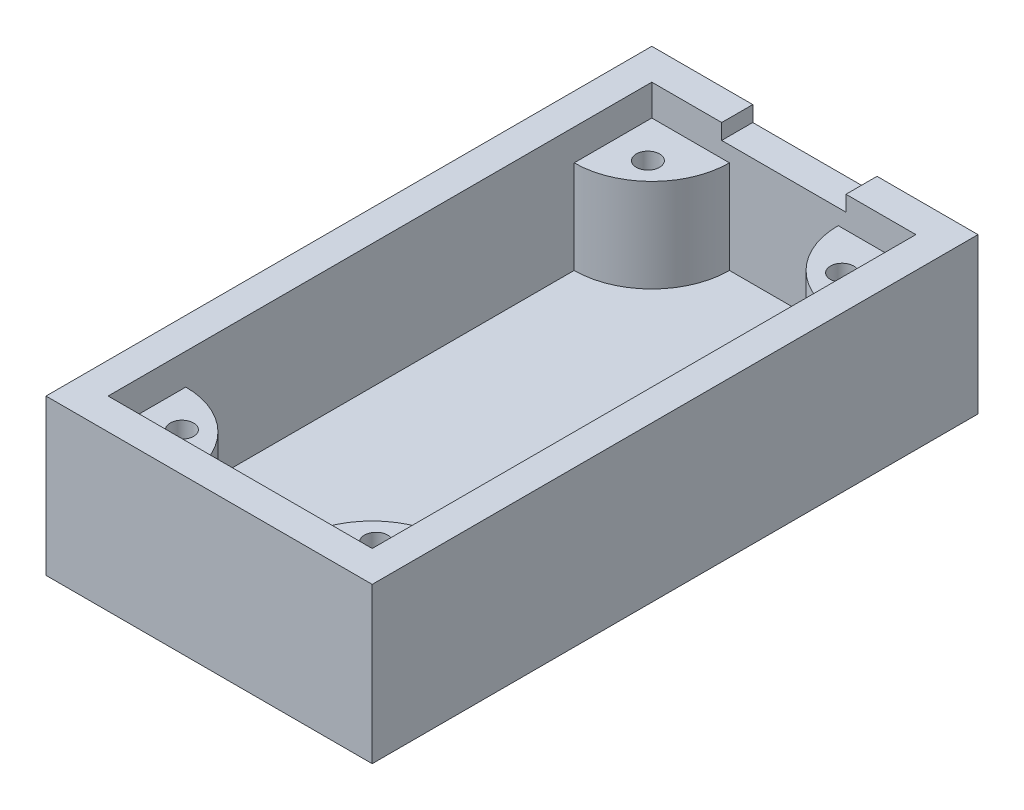
ISO-10303-21;
HEADER;
FILE_DESCRIPTION(('STEP AP214'),'2;1');
FILE_NAME('part.step','',(''),(''),'','','');
FILE_SCHEMA(('AUTOMOTIVE_DESIGN { 1 0 10303 214 1 1 1 1 }'));
ENDSEC;
DATA;
#1=APPLICATION_CONTEXT('core data for automotive mechanical design processes');
#2=APPLICATION_PROTOCOL_DEFINITION('international standard','automotive_design',2000,#1);
#3=PRODUCT_CONTEXT('',#1,'mechanical');
#4=PRODUCT('Part','Part','',(#3));
#5=PRODUCT_RELATED_PRODUCT_CATEGORY('part','',(#4));
#6=PRODUCT_DEFINITION_FORMATION('','',#4);
#7=PRODUCT_DEFINITION_CONTEXT('part definition',#1,'design');
#8=PRODUCT_DEFINITION('design','',#6,#7);
#9=PRODUCT_DEFINITION_SHAPE('','',#8);
#10=(LENGTH_UNIT() NAMED_UNIT(*) SI_UNIT(.MILLI.,.METRE.));
#11=(NAMED_UNIT(*) PLANE_ANGLE_UNIT() SI_UNIT($,.RADIAN.));
#12=(NAMED_UNIT(*) SI_UNIT($,.STERADIAN.) SOLID_ANGLE_UNIT());
#13=UNCERTAINTY_MEASURE_WITH_UNIT(LENGTH_MEASURE(1.E-05),#10,'distance_accuracy_value','');
#14=(GEOMETRIC_REPRESENTATION_CONTEXT(3) GLOBAL_UNCERTAINTY_ASSIGNED_CONTEXT((#13)) GLOBAL_UNIT_ASSIGNED_CONTEXT((#10,
#11,#12)) REPRESENTATION_CONTEXT('',''));
#15=CARTESIAN_POINT('',(0.,0.,0.));
#16=DIRECTION('',(0.,0.,1.));
#17=DIRECTION('',(1.,0.,0.));
#18=AXIS2_PLACEMENT_3D('',#15,#16,#17);
#19=CARTESIAN_POINT('',(0.,8.,-35.));
#20=DIRECTION('',(0.,0.,1.));
#21=DIRECTION('',(1.,0.,0.));
#22=AXIS2_PLACEMENT_3D('',#19,#20,#21);
#23=PLANE('',#22);
#24=DIRECTION('',(0.,-1.,0.));
#25=VECTOR('',#24,1.);
#26=CARTESIAN_POINT('',(12.5,8.,-35.));
#27=LINE('',#26,#25);
#28=CARTESIAN_POINT('',(12.5,8.,-35.));
#29=VERTEX_POINT('',#28);
#30=CARTESIAN_POINT('',(12.5,7.,-35.));
#31=VERTEX_POINT('',#30);
#32=EDGE_CURVE('E201',#29,#31,#27,.T.);
#33=ORIENTED_EDGE('',*,*,#32,.T.);
#34=DIRECTION('',(-1.,0.,0.));
#35=VECTOR('',#34,1.);
#36=CARTESIAN_POINT('',(12.5,7.,-35.));
#37=LINE('',#36,#35);
#38=CARTESIAN_POINT('',(4.5,7.,-35.));
#39=VERTEX_POINT('',#38);
#40=EDGE_CURVE('E193',#31,#39,#37,.T.);
#41=ORIENTED_EDGE('',*,*,#40,.T.);
#42=DIRECTION('',(0.,1.,0.));
#43=VECTOR('',#42,1.);
#44=CARTESIAN_POINT('',(4.5,8.,-35.));
#45=LINE('',#44,#43);
#46=CARTESIAN_POINT('',(4.5,8.,-35.));
#47=VERTEX_POINT('',#46);
#48=EDGE_CURVE('E179',#39,#47,#45,.T.);
#49=ORIENTED_EDGE('',*,*,#48,.T.);
#50=DIRECTION('',(-1.,0.,0.));
#51=VECTOR('',#50,1.);
#52=CARTESIAN_POINT('',(0.,8.,-35.));
#53=LINE('',#52,#51);
#54=CARTESIAN_POINT('',(0.,8.,-35.));
#55=VERTEX_POINT('',#54);
#56=EDGE_CURVE('E374',#47,#55,#53,.T.);
#57=ORIENTED_EDGE('',*,*,#56,.T.);
#58=DIRECTION('',(0.,-1.,0.));
#59=VECTOR('',#58,1.);
#60=CARTESIAN_POINT('',(0.,8.,-35.));
#61=LINE('',#60,#59);
#62=CARTESIAN_POINT('',(0.,6.,-35.));
#63=VERTEX_POINT('',#62);
#64=EDGE_CURVE('E378',#55,#63,#61,.T.);
#65=ORIENTED_EDGE('',*,*,#64,.T.);
#66=DIRECTION('',(-1.,0.,0.));
#67=VECTOR('',#66,1.);
#68=CARTESIAN_POINT('',(5.,6.,-35.));
#69=LINE('',#68,#67);
#70=CARTESIAN_POINT('',(5.,6.,-35.));
#71=VERTEX_POINT('',#70);
#72=EDGE_CURVE('E64',#71,#63,#69,.T.);
#73=ORIENTED_EDGE('',*,*,#72,.F.);
#74=DIRECTION('',(0.,-1.,0.));
#75=VECTOR('',#74,1.);
#76=CARTESIAN_POINT('',(5.,15.0710678118655,-35.));
#77=LINE('',#76,#75);
#78=CARTESIAN_POINT('',(5.,0.,-35.));
#79=VERTEX_POINT('',#78);
#80=EDGE_CURVE('E244',#71,#79,#77,.T.);
#81=ORIENTED_EDGE('',*,*,#80,.T.);
#82=DIRECTION('',(-1.,0.,0.));
#83=VECTOR('',#82,1.);
#84=CARTESIAN_POINT('',(0.,0.,-35.));
#85=LINE('',#84,#83);
#86=CARTESIAN_POINT('',(12.,0.,-35.));
#87=VERTEX_POINT('',#86);
#88=EDGE_CURVE('E367',#87,#79,#85,.T.);
#89=ORIENTED_EDGE('',*,*,#88,.F.);
#90=DIRECTION('',(0.,-1.,0.));
#91=VECTOR('',#90,1.);
#92=CARTESIAN_POINT('',(12.,15.0710678118655,-35.));
#93=LINE('',#92,#91);
#94=CARTESIAN_POINT('',(12.,6.,-35.));
#95=VERTEX_POINT('',#94);
#96=EDGE_CURVE('E271',#95,#87,#93,.T.);
#97=ORIENTED_EDGE('',*,*,#96,.F.);
#98=DIRECTION('',(-1.,0.,0.));
#99=VECTOR('',#98,1.);
#100=CARTESIAN_POINT('',(17.,6.,-35.));
#101=LINE('',#100,#99);
#102=CARTESIAN_POINT('',(17.,6.,-35.));
#103=VERTEX_POINT('',#102);
#104=EDGE_CURVE('E251',#103,#95,#101,.T.);
#105=ORIENTED_EDGE('',*,*,#104,.F.);
#106=DIRECTION('',(0.,-1.,0.));
#107=VECTOR('',#106,1.);
#108=CARTESIAN_POINT('',(17.,8.,-35.));
#109=LINE('',#108,#107);
#110=CARTESIAN_POINT('',(17.,8.,-35.));
#111=VERTEX_POINT('',#110);
#112=EDGE_CURVE('E391',#111,#103,#109,.T.);
#113=ORIENTED_EDGE('',*,*,#112,.F.);
#114=EDGE_CURVE('E375',#111,#29,#53,.T.);
#115=ORIENTED_EDGE('',*,*,#114,.T.);
#116=EDGE_LOOP('',(#33,#41,#49,#57,#65,#73,#81,#89,#97,#105,#113,#115));
#117=FACE_BOUND('',#116,.T.);
#118=ADVANCED_FACE('F40',(#117),#23,.T.);
#119=CARTESIAN_POINT('',(0.,8.,0.));
#120=DIRECTION('',(1.,0.,0.));
#121=DIRECTION('',(0.,0.,-1.));
#122=AXIS2_PLACEMENT_3D('',#119,#120,#121);
#123=PLANE('',#122);
#124=DIRECTION('',(0.,0.,1.));
#125=VECTOR('',#124,1.);
#126=CARTESIAN_POINT('',(0.,0.,0.));
#127=LINE('',#126,#125);
#128=CARTESIAN_POINT('',(0.,0.,-30.));
#129=VERTEX_POINT('',#128);
#130=CARTESIAN_POINT('',(0.,0.,-5.));
#131=VERTEX_POINT('',#130);
#132=EDGE_CURVE('E362',#129,#131,#127,.T.);
#133=ORIENTED_EDGE('',*,*,#132,.F.);
#134=DIRECTION('',(0.,-1.,0.));
#135=VECTOR('',#134,1.);
#136=CARTESIAN_POINT('',(0.,15.0710678118655,-30.));
#137=LINE('',#136,#135);
#138=CARTESIAN_POINT('',(0.,6.,-30.));
#139=VERTEX_POINT('',#138);
#140=EDGE_CURVE('E240',#139,#129,#137,.T.);
#141=ORIENTED_EDGE('',*,*,#140,.F.);
#142=DIRECTION('',(0.,0.,1.));
#143=VECTOR('',#142,1.);
#144=CARTESIAN_POINT('',(0.,6.,-30.));
#145=LINE('',#144,#143);
#146=EDGE_CURVE('E222',#63,#139,#145,.T.);
#147=ORIENTED_EDGE('',*,*,#146,.F.);
#148=ORIENTED_EDGE('',*,*,#64,.F.);
#149=DIRECTION('',(0.,0.,1.));
#150=VECTOR('',#149,1.);
#151=CARTESIAN_POINT('',(0.,8.,0.));
#152=LINE('',#151,#150);
#153=CARTESIAN_POINT('',(0.,8.,0.));
#154=VERTEX_POINT('',#153);
#155=EDGE_CURVE('E363',#55,#154,#152,.T.);
#156=ORIENTED_EDGE('',*,*,#155,.T.);
#157=DIRECTION('',(0.,-1.,0.));
#158=VECTOR('',#157,1.);
#159=CARTESIAN_POINT('',(0.,8.,0.));
#160=LINE('',#159,#158);
#161=CARTESIAN_POINT('',(0.,6.,0.));
#162=VERTEX_POINT('',#161);
#163=EDGE_CURVE('E399',#154,#162,#160,.T.);
#164=ORIENTED_EDGE('',*,*,#163,.T.);
#165=DIRECTION('',(0.,0.,1.));
#166=VECTOR('',#165,1.);
#167=CARTESIAN_POINT('',(0.,6.,0.));
#168=LINE('',#167,#166);
#169=CARTESIAN_POINT('',(0.,6.,-5.));
#170=VERTEX_POINT('',#169);
#171=EDGE_CURVE('E287',#170,#162,#168,.T.);
#172=ORIENTED_EDGE('',*,*,#171,.F.);
#173=DIRECTION('',(0.,-1.,0.));
#174=VECTOR('',#173,1.);
#175=CARTESIAN_POINT('',(0.,15.0710678118655,-5.));
#176=LINE('',#175,#174);
#177=EDGE_CURVE('E307',#170,#131,#176,.T.);
#178=ORIENTED_EDGE('',*,*,#177,.T.);
#179=EDGE_LOOP('',(#133,#141,#147,#148,#156,#164,#172,#178));
#180=FACE_BOUND('',#179,.T.);
#181=ADVANCED_FACE('F455',(#180),#123,.T.);
#182=CARTESIAN_POINT('',(17.,8.,0.));
#183=DIRECTION('',(-1.,0.,0.));
#184=DIRECTION('',(0.,0.,1.));
#185=AXIS2_PLACEMENT_3D('',#182,#183,#184);
#186=PLANE('',#185);
#187=DIRECTION('',(0.,0.,-1.));
#188=VECTOR('',#187,1.);
#189=CARTESIAN_POINT('',(17.,6.,-30.));
#190=LINE('',#189,#188);
#191=CARTESIAN_POINT('',(17.,6.,-30.));
#192=VERTEX_POINT('',#191);
#193=EDGE_CURVE('E255',#192,#103,#190,.T.);
#194=ORIENTED_EDGE('',*,*,#193,.F.);
#195=DIRECTION('',(0.,-1.,0.));
#196=VECTOR('',#195,1.);
#197=CARTESIAN_POINT('',(17.,15.0710678118655,-30.));
#198=LINE('',#197,#196);
#199=CARTESIAN_POINT('',(17.,0.,-30.));
#200=VERTEX_POINT('',#199);
#201=EDGE_CURVE('E275',#192,#200,#198,.T.);
#202=ORIENTED_EDGE('',*,*,#201,.T.);
#203=DIRECTION('',(0.,0.,-1.));
#204=VECTOR('',#203,1.);
#205=CARTESIAN_POINT('',(17.,0.,0.));
#206=LINE('',#205,#204);
#207=CARTESIAN_POINT('',(17.,0.,-5.));
#208=VERTEX_POINT('',#207);
#209=EDGE_CURVE('E384',#208,#200,#206,.T.);
#210=ORIENTED_EDGE('',*,*,#209,.F.);
#211=DIRECTION('',(0.,-1.,0.));
#212=VECTOR('',#211,1.);
#213=CARTESIAN_POINT('',(17.,15.0710678118655,-5.));
#214=LINE('',#213,#212);
#215=CARTESIAN_POINT('',(17.,6.,-5.));
#216=VERTEX_POINT('',#215);
#217=EDGE_CURVE('E339',#216,#208,#214,.T.);
#218=ORIENTED_EDGE('',*,*,#217,.F.);
#219=DIRECTION('',(0.,0.,-1.));
#220=VECTOR('',#219,1.);
#221=CARTESIAN_POINT('',(17.,6.,0.));
#222=LINE('',#221,#220);
#223=CARTESIAN_POINT('',(17.,6.,0.));
#224=VERTEX_POINT('',#223);
#225=EDGE_CURVE('E323',#224,#216,#222,.T.);
#226=ORIENTED_EDGE('',*,*,#225,.F.);
#227=DIRECTION('',(0.,-1.,0.));
#228=VECTOR('',#227,1.);
#229=CARTESIAN_POINT('',(17.,8.,0.));
#230=LINE('',#229,#228);
#231=CARTESIAN_POINT('',(17.,8.,0.));
#232=VERTEX_POINT('',#231);
#233=EDGE_CURVE('E395',#232,#224,#230,.T.);
#234=ORIENTED_EDGE('',*,*,#233,.F.);
#235=DIRECTION('',(0.,0.,-1.));
#236=VECTOR('',#235,1.);
#237=CARTESIAN_POINT('',(17.,8.,0.));
#238=LINE('',#237,#236);
#239=EDGE_CURVE('E370',#232,#111,#238,.T.);
#240=ORIENTED_EDGE('',*,*,#239,.T.);
#241=ORIENTED_EDGE('',*,*,#112,.T.);
#242=EDGE_LOOP('',(#194,#202,#210,#218,#226,#234,#240,#241));
#243=FACE_BOUND('',#242,.T.);
#244=ADVANCED_FACE('F464',(#243),#186,.T.);
#245=CARTESIAN_POINT('',(0.,8.,0.));
#246=DIRECTION('',(0.,0.,-1.));
#247=DIRECTION('',(-1.,0.,0.));
#248=AXIS2_PLACEMENT_3D('',#245,#246,#247);
#249=PLANE('',#248);
#250=DIRECTION('',(1.,0.,0.));
#251=VECTOR('',#250,1.);
#252=CARTESIAN_POINT('',(0.,0.,0.));
#253=LINE('',#252,#251);
#254=CARTESIAN_POINT('',(5.,0.,0.));
#255=VERTEX_POINT('',#254);
#256=CARTESIAN_POINT('',(12.,0.,0.));
#257=VERTEX_POINT('',#256);
#258=EDGE_CURVE('E381',#255,#257,#253,.T.);
#259=ORIENTED_EDGE('',*,*,#258,.F.);
#260=DIRECTION('',(0.,-1.,0.));
#261=VECTOR('',#260,1.);
#262=CARTESIAN_POINT('',(5.,15.0710678118655,0.));
#263=LINE('',#262,#261);
#264=CARTESIAN_POINT('',(5.,6.,0.));
#265=VERTEX_POINT('',#264);
#266=EDGE_CURVE('E303',#265,#255,#263,.T.);
#267=ORIENTED_EDGE('',*,*,#266,.F.);
#268=DIRECTION('',(1.,0.,0.));
#269=VECTOR('',#268,1.);
#270=CARTESIAN_POINT('',(5.,6.,0.));
#271=LINE('',#270,#269);
#272=EDGE_CURVE('E283',#162,#265,#271,.T.);
#273=ORIENTED_EDGE('',*,*,#272,.F.);
#274=ORIENTED_EDGE('',*,*,#163,.F.);
#275=DIRECTION('',(1.,0.,0.));
#276=VECTOR('',#275,1.);
#277=CARTESIAN_POINT('',(0.,8.,0.));
#278=LINE('',#277,#276);
#279=EDGE_CURVE('E366',#154,#232,#278,.T.);
#280=ORIENTED_EDGE('',*,*,#279,.T.);
#281=ORIENTED_EDGE('',*,*,#233,.T.);
#282=DIRECTION('',(1.,0.,0.));
#283=VECTOR('',#282,1.);
#284=CARTESIAN_POINT('',(17.,6.,0.));
#285=LINE('',#284,#283);
#286=CARTESIAN_POINT('',(12.,6.,0.));
#287=VERTEX_POINT('',#286);
#288=EDGE_CURVE('E315',#287,#224,#285,.T.);
#289=ORIENTED_EDGE('',*,*,#288,.F.);
#290=DIRECTION('',(0.,-1.,0.));
#291=VECTOR('',#290,1.);
#292=CARTESIAN_POINT('',(12.,15.0710678118655,0.));
#293=LINE('',#292,#291);
#294=EDGE_CURVE('E335',#287,#257,#293,.T.);
#295=ORIENTED_EDGE('',*,*,#294,.T.);
#296=EDGE_LOOP('',(#259,#267,#273,#274,#280,#281,#289,#295));
#297=FACE_BOUND('',#296,.T.);
#298=ADVANCED_FACE('F462',(#297),#249,.T.);
#299=CARTESIAN_POINT('',(0.,8.,0.));
#300=DIRECTION('',(0.,1.,0.));
#301=DIRECTION('',(0.,0.,1.));
#302=AXIS2_PLACEMENT_3D('',#299,#300,#301);
#303=PLANE('',#302);
#304=DIRECTION('',(0.,0.,-1.));
#305=VECTOR('',#304,1.);
#306=CARTESIAN_POINT('',(12.5,8.,2.001));
#307=LINE('',#306,#305);
#308=CARTESIAN_POINT('',(12.5,8.,-37.));
#309=VERTEX_POINT('',#308);
#310=EDGE_CURVE('E189',#29,#309,#307,.T.);
#311=ORIENTED_EDGE('',*,*,#310,.F.);
#312=ORIENTED_EDGE('',*,*,#114,.F.);
#313=ORIENTED_EDGE('',*,*,#239,.F.);
#314=ORIENTED_EDGE('',*,*,#279,.F.);
#315=ORIENTED_EDGE('',*,*,#155,.F.);
#316=ORIENTED_EDGE('',*,*,#56,.F.);
#317=DIRECTION('',(0.,0.,-1.));
#318=VECTOR('',#317,1.);
#319=CARTESIAN_POINT('',(4.5,8.,2.001));
#320=LINE('',#319,#318);
#321=CARTESIAN_POINT('',(4.5,8.,-37.));
#322=VERTEX_POINT('',#321);
#323=EDGE_CURVE('E185',#47,#322,#320,.T.);
#324=ORIENTED_EDGE('',*,*,#323,.T.);
#325=DIRECTION('',(-1.,0.,0.));
#326=VECTOR('',#325,1.);
#327=CARTESIAN_POINT('',(-2.,8.,-37.));
#328=LINE('',#327,#326);
#329=CARTESIAN_POINT('',(-2.,8.,-37.));
#330=VERTEX_POINT('',#329);
#331=EDGE_CURVE('E413',#322,#330,#328,.T.);
#332=ORIENTED_EDGE('',*,*,#331,.T.);
#333=DIRECTION('',(0.,0.,1.));
#334=VECTOR('',#333,1.);
#335=CARTESIAN_POINT('',(-2.,8.,-37.));
#336=LINE('',#335,#334);
#337=CARTESIAN_POINT('',(-2.,8.,2.));
#338=VERTEX_POINT('',#337);
#339=EDGE_CURVE('E403',#330,#338,#336,.T.);
#340=ORIENTED_EDGE('',*,*,#339,.T.);
#341=DIRECTION('',(1.,0.,0.));
#342=VECTOR('',#341,1.);
#343=CARTESIAN_POINT('',(-2.,8.,2.));
#344=LINE('',#343,#342);
#345=CARTESIAN_POINT('',(19.,8.,2.));
#346=VERTEX_POINT('',#345);
#347=EDGE_CURVE('E407',#338,#346,#344,.T.);
#348=ORIENTED_EDGE('',*,*,#347,.T.);
#349=DIRECTION('',(0.,0.,-1.));
#350=VECTOR('',#349,1.);
#351=CARTESIAN_POINT('',(19.,8.,-37.));
#352=LINE('',#351,#350);
#353=CARTESIAN_POINT('',(19.,8.,-37.));
#354=VERTEX_POINT('',#353);
#355=EDGE_CURVE('E410',#346,#354,#352,.T.);
#356=ORIENTED_EDGE('',*,*,#355,.T.);
#357=EDGE_CURVE('E414',#354,#309,#328,.T.);
#358=ORIENTED_EDGE('',*,*,#357,.T.);
#359=EDGE_LOOP('',(#311,#312,#313,#314,#315,#316,#324,#332,#340,#348,#356,#358));
#360=FACE_BOUND('',#359,.T.);
#361=ADVANCED_FACE('F447',(#360),#303,.T.);
#362=CARTESIAN_POINT('',(-2.,8.,-37.));
#363=DIRECTION('',(1.,0.,0.));
#364=DIRECTION('',(0.,0.,-1.));
#365=AXIS2_PLACEMENT_3D('',#362,#363,#364);
#366=PLANE('',#365);
#367=DIRECTION('',(0.,-1.,0.));
#368=VECTOR('',#367,1.);
#369=CARTESIAN_POINT('',(-2.,8.,-37.));
#370=LINE('',#369,#368);
#371=CARTESIAN_POINT('',(-2.,-2.,-37.));
#372=VERTEX_POINT('',#371);
#373=EDGE_CURVE('E418',#330,#372,#370,.T.);
#374=ORIENTED_EDGE('',*,*,#373,.T.);
#375=DIRECTION('',(0.,0.,-1.));
#376=VECTOR('',#375,1.);
#377=CARTESIAN_POINT('',(-2.,-2.,2.));
#378=LINE('',#377,#376);
#379=CARTESIAN_POINT('',(-2.,-2.,2.));
#380=VERTEX_POINT('',#379);
#381=EDGE_CURVE('E350',#380,#372,#378,.T.);
#382=ORIENTED_EDGE('',*,*,#381,.F.);
#383=DIRECTION('',(0.,-1.,0.));
#384=VECTOR('',#383,1.);
#385=CARTESIAN_POINT('',(-2.,8.,2.));
#386=LINE('',#385,#384);
#387=EDGE_CURVE('E12',#338,#380,#386,.T.);
#388=ORIENTED_EDGE('',*,*,#387,.F.);
#389=ORIENTED_EDGE('',*,*,#339,.F.);
#390=EDGE_LOOP('',(#374,#382,#388,#389));
#391=FACE_BOUND('',#390,.T.);
#392=ADVANCED_FACE('F42',(#391),#366,.F.);
#393=CARTESIAN_POINT('',(-2.,8.,2.));
#394=DIRECTION('',(0.,0.,-1.));
#395=DIRECTION('',(-1.,0.,0.));
#396=AXIS2_PLACEMENT_3D('',#393,#394,#395);
#397=PLANE('',#396);
#398=ORIENTED_EDGE('',*,*,#387,.T.);
#399=DIRECTION('',(-1.,0.,0.));
#400=VECTOR('',#399,1.);
#401=CARTESIAN_POINT('',(19.,-2.,2.));
#402=LINE('',#401,#400);
#403=CARTESIAN_POINT('',(19.,-2.,2.));
#404=VERTEX_POINT('',#403);
#405=EDGE_CURVE('E343',#404,#380,#402,.T.);
#406=ORIENTED_EDGE('',*,*,#405,.F.);
#407=DIRECTION('',(0.,-1.,0.));
#408=VECTOR('',#407,1.);
#409=CARTESIAN_POINT('',(19.,8.,2.));
#410=LINE('',#409,#408);
#411=EDGE_CURVE('E49',#346,#404,#410,.T.);
#412=ORIENTED_EDGE('',*,*,#411,.F.);
#413=ORIENTED_EDGE('',*,*,#347,.F.);
#414=EDGE_LOOP('',(#398,#406,#412,#413));
#415=FACE_BOUND('',#414,.T.);
#416=ADVANCED_FACE('F435',(#415),#397,.F.);
#417=CARTESIAN_POINT('',(19.,8.,-37.));
#418=DIRECTION('',(-1.,0.,0.));
#419=DIRECTION('',(0.,0.,1.));
#420=AXIS2_PLACEMENT_3D('',#417,#418,#419);
#421=PLANE('',#420);
#422=ORIENTED_EDGE('',*,*,#411,.T.);
#423=DIRECTION('',(0.,0.,1.));
#424=VECTOR('',#423,1.);
#425=CARTESIAN_POINT('',(19.,-2.,-37.));
#426=LINE('',#425,#424);
#427=CARTESIAN_POINT('',(19.,-2.,-37.));
#428=VERTEX_POINT('',#427);
#429=EDGE_CURVE('E358',#428,#404,#426,.T.);
#430=ORIENTED_EDGE('',*,*,#429,.F.);
#431=DIRECTION('',(0.,-1.,0.));
#432=VECTOR('',#431,1.);
#433=CARTESIAN_POINT('',(19.,8.,-37.));
#434=LINE('',#433,#432);
#435=EDGE_CURVE('E421',#354,#428,#434,.T.);
#436=ORIENTED_EDGE('',*,*,#435,.F.);
#437=ORIENTED_EDGE('',*,*,#355,.F.);
#438=EDGE_LOOP('',(#422,#430,#436,#437));
#439=FACE_BOUND('',#438,.T.);
#440=ADVANCED_FACE('F428',(#439),#421,.F.);
#441=CARTESIAN_POINT('',(-2.,8.,-37.));
#442=DIRECTION('',(0.,0.,1.));
#443=DIRECTION('',(1.,0.,0.));
#444=AXIS2_PLACEMENT_3D('',#441,#442,#443);
#445=PLANE('',#444);
#446=DIRECTION('',(-1.,0.,0.));
#447=VECTOR('',#446,1.);
#448=CARTESIAN_POINT('',(12.5,7.,-37.));
#449=LINE('',#448,#447);
#450=CARTESIAN_POINT('',(12.5,7.,-37.));
#451=VERTEX_POINT('',#450);
#452=CARTESIAN_POINT('',(4.5,7.,-37.));
#453=VERTEX_POINT('',#452);
#454=EDGE_CURVE('E195',#451,#453,#449,.T.);
#455=ORIENTED_EDGE('',*,*,#454,.F.);
#456=DIRECTION('',(0.,-1.,0.));
#457=VECTOR('',#456,1.);
#458=CARTESIAN_POINT('',(12.5,8.,-37.));
#459=LINE('',#458,#457);
#460=EDGE_CURVE('E56',#309,#451,#459,.T.);
#461=ORIENTED_EDGE('',*,*,#460,.F.);
#462=ORIENTED_EDGE('',*,*,#357,.F.);
#463=ORIENTED_EDGE('',*,*,#435,.T.);
#464=DIRECTION('',(1.,0.,0.));
#465=VECTOR('',#464,1.);
#466=CARTESIAN_POINT('',(-2.,-2.,-37.));
#467=LINE('',#466,#465);
#468=EDGE_CURVE('E354',#372,#428,#467,.T.);
#469=ORIENTED_EDGE('',*,*,#468,.F.);
#470=ORIENTED_EDGE('',*,*,#373,.F.);
#471=ORIENTED_EDGE('',*,*,#331,.F.);
#472=DIRECTION('',(0.,1.,0.));
#473=VECTOR('',#472,1.);
#474=CARTESIAN_POINT('',(4.5,8.,-37.));
#475=LINE('',#474,#473);
#476=EDGE_CURVE('E207',#453,#322,#475,.T.);
#477=ORIENTED_EDGE('',*,*,#476,.F.);
#478=EDGE_LOOP('',(#455,#461,#462,#463,#469,#470,#471,#477));
#479=FACE_BOUND('',#478,.T.);
#480=ADVANCED_FACE('F442',(#479),#445,.F.);
#481=CARTESIAN_POINT('',(0.,0.,0.));
#482=DIRECTION('',(0.,-1.,0.));
#483=DIRECTION('',(0.,0.,-1.));
#484=AXIS2_PLACEMENT_3D('',#481,#482,#483);
#485=PLANE('',#484);
#486=CARTESIAN_POINT('',(0.,0.,-35.));
#487=DIRECTION('',(0.,1.,0.));
#488=DIRECTION('',(0.,0.,1.));
#489=AXIS2_PLACEMENT_3D('',#486,#487,#488);
#490=CIRCLE('',#489,5.);
#491=EDGE_CURVE('E236',#129,#79,#490,.T.);
#492=ORIENTED_EDGE('',*,*,#491,.F.);
#493=ORIENTED_EDGE('',*,*,#132,.T.);
#494=CARTESIAN_POINT('',(0.,0.,0.));
#495=DIRECTION('',(0.,1.,0.));
#496=DIRECTION('',(0.,0.,1.));
#497=AXIS2_PLACEMENT_3D('',#494,#495,#496);
#498=CIRCLE('',#497,5.);
#499=EDGE_CURVE('E299',#255,#131,#498,.T.);
#500=ORIENTED_EDGE('',*,*,#499,.F.);
#501=ORIENTED_EDGE('',*,*,#258,.T.);
#502=CARTESIAN_POINT('',(17.,0.,0.));
#503=DIRECTION('',(0.,1.,0.));
#504=DIRECTION('',(0.,0.,1.));
#505=AXIS2_PLACEMENT_3D('',#502,#503,#504);
#506=CIRCLE('',#505,5.);
#507=EDGE_CURVE('E331',#208,#257,#506,.T.);
#508=ORIENTED_EDGE('',*,*,#507,.F.);
#509=ORIENTED_EDGE('',*,*,#209,.T.);
#510=CARTESIAN_POINT('',(17.,0.,-35.));
#511=DIRECTION('',(0.,1.,0.));
#512=DIRECTION('',(0.,0.,1.));
#513=AXIS2_PLACEMENT_3D('',#510,#511,#512);
#514=CIRCLE('',#513,5.);
#515=EDGE_CURVE('E267',#87,#200,#514,.T.);
#516=ORIENTED_EDGE('',*,*,#515,.F.);
#517=ORIENTED_EDGE('',*,*,#88,.T.);
#518=EDGE_LOOP('',(#492,#493,#500,#501,#508,#509,#516,#517));
#519=FACE_BOUND('',#518,.T.);
#520=ADVANCED_FACE('F473',(#519),#485,.F.);
#521=CARTESIAN_POINT('',(0.,-2.,0.));
#522=DIRECTION('',(0.,-1.,0.));
#523=DIRECTION('',(0.,0.,-1.));
#524=AXIS2_PLACEMENT_3D('',#521,#522,#523);
#525=PLANE('',#524);
#526=ORIENTED_EDGE('',*,*,#405,.T.);
#527=ORIENTED_EDGE('',*,*,#381,.T.);
#528=ORIENTED_EDGE('',*,*,#468,.T.);
#529=ORIENTED_EDGE('',*,*,#429,.T.);
#530=EDGE_LOOP('',(#526,#527,#528,#529));
#531=FACE_BOUND('',#530,.T.);
#532=ADVANCED_FACE('F433',(#531),#525,.T.);
#533=CARTESIAN_POINT('',(17.,15.0710678118655,0.));
#534=DIRECTION('',(0.,-1.,0.));
#535=DIRECTION('',(0.,0.,-1.));
#536=AXIS2_PLACEMENT_3D('',#533,#534,#535);
#537=CYLINDRICAL_SURFACE('',#536,5.);
#538=CARTESIAN_POINT('',(17.,6.,0.));
#539=DIRECTION('',(0.,1.,0.));
#540=DIRECTION('',(0.,0.,1.));
#541=AXIS2_PLACEMENT_3D('',#538,#539,#540);
#542=CIRCLE('',#541,5.);
#543=EDGE_CURVE('E319',#216,#287,#542,.T.);
#544=ORIENTED_EDGE('',*,*,#543,.F.);
#545=ORIENTED_EDGE('',*,*,#217,.T.);
#546=ORIENTED_EDGE('',*,*,#507,.T.);
#547=ORIENTED_EDGE('',*,*,#294,.F.);
#548=EDGE_LOOP('',(#544,#545,#546,#547));
#549=FACE_BOUND('',#548,.T.);
#550=ADVANCED_FACE('F471',(#549),#537,.T.);
#551=CARTESIAN_POINT('',(14.75,15.0710678118655,-2.5));
#552=DIRECTION('',(0.,-1.,0.));
#553=DIRECTION('',(0.,0.,-1.));
#554=AXIS2_PLACEMENT_3D('',#551,#552,#553);
#555=CYLINDRICAL_SURFACE('',#554,0.75);
#556=CARTESIAN_POINT('',(14.75,0.,-2.5));
#557=DIRECTION('',(0.,1.,0.));
#558=DIRECTION('',(0.,0.,1.));
#559=AXIS2_PLACEMENT_3D('',#556,#557,#558);
#560=CIRCLE('',#559,0.75);
#561=CARTESIAN_POINT('',(14.75,0.,-1.75));
#562=VERTEX_POINT('',#561);
#563=EDGE_CURVE('E327',#562,#562,#560,.T.);
#564=ORIENTED_EDGE('',*,*,#563,.F.);
#565=EDGE_LOOP('',(#564));
#566=FACE_BOUND('',#565,.T.);
#567=CARTESIAN_POINT('',(14.75,6.,-2.5));
#568=DIRECTION('',(0.,1.,0.));
#569=DIRECTION('',(0.,0.,1.));
#570=AXIS2_PLACEMENT_3D('',#567,#568,#569);
#571=CIRCLE('',#570,0.75);
#572=CARTESIAN_POINT('',(14.75,6.,-1.75));
#573=VERTEX_POINT('',#572);
#574=EDGE_CURVE('E311',#573,#573,#571,.T.);
#575=ORIENTED_EDGE('',*,*,#574,.T.);
#576=EDGE_LOOP('',(#575));
#577=FACE_BOUND('',#576,.T.);
#578=ADVANCED_FACE('F565',(#566,#577),#555,.F.);
#579=CARTESIAN_POINT('',(0.,6.,0.));
#580=DIRECTION('',(0.,1.,0.));
#581=DIRECTION('',(0.,0.,1.));
#582=AXIS2_PLACEMENT_3D('',#579,#580,#581);
#583=PLANE('',#582);
#584=ORIENTED_EDGE('',*,*,#574,.F.);
#585=EDGE_LOOP('',(#584));
#586=FACE_BOUND('',#585,.T.);
#587=ORIENTED_EDGE('',*,*,#288,.T.);
#588=ORIENTED_EDGE('',*,*,#225,.T.);
#589=ORIENTED_EDGE('',*,*,#543,.T.);
#590=EDGE_LOOP('',(#587,#588,#589));
#591=FACE_BOUND('',#590,.T.);
#592=ADVANCED_FACE('F468',(#586,#591),#583,.T.);
#593=ORIENTED_EDGE('',*,*,#563,.T.);
#594=EDGE_LOOP('',(#593));
#595=FACE_BOUND('',#594,.T.);
#596=ADVANCED_FACE('F499',(#595),#485,.F.);
#597=CARTESIAN_POINT('',(0.,15.0710678118655,0.));
#598=DIRECTION('',(0.,-1.,0.));
#599=DIRECTION('',(0.,0.,-1.));
#600=AXIS2_PLACEMENT_3D('',#597,#598,#599);
#601=CYLINDRICAL_SURFACE('',#600,5.);
#602=CARTESIAN_POINT('',(0.,6.,0.));
#603=DIRECTION('',(0.,1.,0.));
#604=DIRECTION('',(0.,0.,1.));
#605=AXIS2_PLACEMENT_3D('',#602,#603,#604);
#606=CIRCLE('',#605,5.);
#607=EDGE_CURVE('E291',#265,#170,#606,.T.);
#608=ORIENTED_EDGE('',*,*,#607,.F.);
#609=ORIENTED_EDGE('',*,*,#266,.T.);
#610=ORIENTED_EDGE('',*,*,#499,.T.);
#611=ORIENTED_EDGE('',*,*,#177,.F.);
#612=EDGE_LOOP('',(#608,#609,#610,#611));
#613=FACE_BOUND('',#612,.T.);
#614=ADVANCED_FACE('F485',(#613),#601,.T.);
#615=CARTESIAN_POINT('',(2.25,15.0710678118655,-2.5));
#616=DIRECTION('',(0.,-1.,0.));
#617=DIRECTION('',(0.,0.,-1.));
#618=AXIS2_PLACEMENT_3D('',#615,#616,#617);
#619=CYLINDRICAL_SURFACE('',#618,0.75);
#620=CARTESIAN_POINT('',(2.25,0.,-2.5));
#621=DIRECTION('',(0.,1.,0.));
#622=DIRECTION('',(0.,0.,1.));
#623=AXIS2_PLACEMENT_3D('',#620,#621,#622);
#624=CIRCLE('',#623,0.75);
#625=CARTESIAN_POINT('',(2.25,0.,-1.75));
#626=VERTEX_POINT('',#625);
#627=EDGE_CURVE('E295',#626,#626,#624,.T.);
#628=ORIENTED_EDGE('',*,*,#627,.F.);
#629=EDGE_LOOP('',(#628));
#630=FACE_BOUND('',#629,.T.);
#631=CARTESIAN_POINT('',(2.25,6.,-2.5));
#632=DIRECTION('',(0.,1.,0.));
#633=DIRECTION('',(0.,0.,1.));
#634=AXIS2_PLACEMENT_3D('',#631,#632,#633);
#635=CIRCLE('',#634,0.75);
#636=CARTESIAN_POINT('',(2.25,6.,-1.75));
#637=VERTEX_POINT('',#636);
#638=EDGE_CURVE('E279',#637,#637,#635,.T.);
#639=ORIENTED_EDGE('',*,*,#638,.T.);
#640=EDGE_LOOP('',(#639));
#641=FACE_BOUND('',#640,.T.);
#642=ADVANCED_FACE('F490',(#630,#641),#619,.F.);
#643=CARTESIAN_POINT('',(0.,6.,0.));
#644=DIRECTION('',(0.,1.,0.));
#645=DIRECTION('',(0.,0.,1.));
#646=AXIS2_PLACEMENT_3D('',#643,#644,#645);
#647=PLANE('',#646);
#648=ORIENTED_EDGE('',*,*,#638,.F.);
#649=EDGE_LOOP('',(#648));
#650=FACE_BOUND('',#649,.T.);
#651=ORIENTED_EDGE('',*,*,#272,.T.);
#652=ORIENTED_EDGE('',*,*,#607,.T.);
#653=ORIENTED_EDGE('',*,*,#171,.T.);
#654=EDGE_LOOP('',(#651,#652,#653));
#655=FACE_BOUND('',#654,.T.);
#656=ADVANCED_FACE('F487',(#650,#655),#647,.T.);
#657=ORIENTED_EDGE('',*,*,#627,.T.);
#658=EDGE_LOOP('',(#657));
#659=FACE_BOUND('',#658,.T.);
#660=ADVANCED_FACE('F489',(#659),#485,.F.);
#661=CARTESIAN_POINT('',(17.,15.0710678118655,-35.));
#662=DIRECTION('',(0.,-1.,0.));
#663=DIRECTION('',(0.,0.,-1.));
#664=AXIS2_PLACEMENT_3D('',#661,#662,#663);
#665=CYLINDRICAL_SURFACE('',#664,5.);
#666=CARTESIAN_POINT('',(17.,6.,-35.));
#667=DIRECTION('',(0.,1.,0.));
#668=DIRECTION('',(0.,0.,1.));
#669=AXIS2_PLACEMENT_3D('',#666,#667,#668);
#670=CIRCLE('',#669,5.);
#671=EDGE_CURVE('E259',#95,#192,#670,.T.);
#672=ORIENTED_EDGE('',*,*,#671,.F.);
#673=ORIENTED_EDGE('',*,*,#96,.T.);
#674=ORIENTED_EDGE('',*,*,#515,.T.);
#675=ORIENTED_EDGE('',*,*,#201,.F.);
#676=EDGE_LOOP('',(#672,#673,#674,#675));
#677=FACE_BOUND('',#676,.T.);
#678=ADVANCED_FACE('F477',(#677),#665,.T.);
#679=CARTESIAN_POINT('',(14.75,15.0710678118655,-32.5));
#680=DIRECTION('',(0.,-1.,0.));
#681=DIRECTION('',(0.,0.,-1.));
#682=AXIS2_PLACEMENT_3D('',#679,#680,#681);
#683=CYLINDRICAL_SURFACE('',#682,0.75);
#684=CARTESIAN_POINT('',(14.75,0.,-32.5));
#685=DIRECTION('',(0.,1.,0.));
#686=DIRECTION('',(0.,0.,1.));
#687=AXIS2_PLACEMENT_3D('',#684,#685,#686);
#688=CIRCLE('',#687,0.75);
#689=CARTESIAN_POINT('',(14.75,0.,-31.75));
#690=VERTEX_POINT('',#689);
#691=EDGE_CURVE('E263',#690,#690,#688,.T.);
#692=ORIENTED_EDGE('',*,*,#691,.F.);
#693=EDGE_LOOP('',(#692));
#694=FACE_BOUND('',#693,.T.);
#695=CARTESIAN_POINT('',(14.75,6.,-32.5));
#696=DIRECTION('',(0.,1.,0.));
#697=DIRECTION('',(0.,0.,1.));
#698=AXIS2_PLACEMENT_3D('',#695,#696,#697);
#699=CIRCLE('',#698,0.75);
#700=CARTESIAN_POINT('',(14.75,6.,-31.75));
#701=VERTEX_POINT('',#700);
#702=EDGE_CURVE('E247',#701,#701,#699,.T.);
#703=ORIENTED_EDGE('',*,*,#702,.T.);
#704=EDGE_LOOP('',(#703));
#705=FACE_BOUND('',#704,.T.);
#706=ADVANCED_FACE('F607',(#694,#705),#683,.F.);
#707=CARTESIAN_POINT('',(0.,6.,0.));
#708=DIRECTION('',(0.,1.,0.));
#709=DIRECTION('',(0.,0.,1.));
#710=AXIS2_PLACEMENT_3D('',#707,#708,#709);
#711=PLANE('',#710);
#712=ORIENTED_EDGE('',*,*,#702,.F.);
#713=EDGE_LOOP('',(#712));
#714=FACE_BOUND('',#713,.T.);
#715=ORIENTED_EDGE('',*,*,#104,.T.);
#716=ORIENTED_EDGE('',*,*,#671,.T.);
#717=ORIENTED_EDGE('',*,*,#193,.T.);
#718=EDGE_LOOP('',(#715,#716,#717));
#719=FACE_BOUND('',#718,.T.);
#720=ADVANCED_FACE('F614',(#714,#719),#711,.T.);
#721=ORIENTED_EDGE('',*,*,#691,.T.);
#722=EDGE_LOOP('',(#721));
#723=FACE_BOUND('',#722,.T.);
#724=ADVANCED_FACE('F500',(#723),#485,.F.);
#725=CARTESIAN_POINT('',(0.,15.0710678118655,-35.));
#726=DIRECTION('',(0.,-1.,0.));
#727=DIRECTION('',(0.,0.,-1.));
#728=AXIS2_PLACEMENT_3D('',#725,#726,#727);
#729=CYLINDRICAL_SURFACE('',#728,5.);
#730=CARTESIAN_POINT('',(0.,6.,-35.));
#731=DIRECTION('',(0.,1.,0.));
#732=DIRECTION('',(0.,0.,1.));
#733=AXIS2_PLACEMENT_3D('',#730,#731,#732);
#734=CIRCLE('',#733,5.);
#735=EDGE_CURVE('E228',#139,#71,#734,.T.);
#736=ORIENTED_EDGE('',*,*,#735,.F.);
#737=ORIENTED_EDGE('',*,*,#140,.T.);
#738=ORIENTED_EDGE('',*,*,#491,.T.);
#739=ORIENTED_EDGE('',*,*,#80,.F.);
#740=EDGE_LOOP('',(#736,#737,#738,#739));
#741=FACE_BOUND('',#740,.T.);
#742=ADVANCED_FACE('F481',(#741),#729,.T.);
#743=CARTESIAN_POINT('',(2.25000000000001,15.0710678118655,-32.5));
#744=DIRECTION('',(0.,-1.,0.));
#745=DIRECTION('',(0.,0.,-1.));
#746=AXIS2_PLACEMENT_3D('',#743,#744,#745);
#747=CYLINDRICAL_SURFACE('',#746,0.75);
#748=CARTESIAN_POINT('',(2.25000000000001,0.,-32.5));
#749=DIRECTION('',(0.,1.,0.));
#750=DIRECTION('',(0.,0.,1.));
#751=AXIS2_PLACEMENT_3D('',#748,#749,#750);
#752=CIRCLE('',#751,0.75);
#753=CARTESIAN_POINT('',(2.25000000000001,0.,-31.75));
#754=VERTEX_POINT('',#753);
#755=EDGE_CURVE('E232',#754,#754,#752,.T.);
#756=ORIENTED_EDGE('',*,*,#755,.F.);
#757=EDGE_LOOP('',(#756));
#758=FACE_BOUND('',#757,.T.);
#759=CARTESIAN_POINT('',(2.25000000000001,6.,-32.5));
#760=DIRECTION('',(0.,1.,0.));
#761=DIRECTION('',(0.,0.,1.));
#762=AXIS2_PLACEMENT_3D('',#759,#760,#761);
#763=CIRCLE('',#762,0.75);
#764=CARTESIAN_POINT('',(2.25000000000001,6.,-31.75));
#765=VERTEX_POINT('',#764);
#766=EDGE_CURVE('E210',#765,#765,#763,.T.);
#767=ORIENTED_EDGE('',*,*,#766,.T.);
#768=EDGE_LOOP('',(#767));
#769=FACE_BOUND('',#768,.T.);
#770=ADVANCED_FACE('F632',(#758,#769),#747,.F.);
#771=CARTESIAN_POINT('',(0.,6.,0.));
#772=DIRECTION('',(0.,1.,0.));
#773=DIRECTION('',(0.,0.,1.));
#774=AXIS2_PLACEMENT_3D('',#771,#772,#773);
#775=PLANE('',#774);
#776=ORIENTED_EDGE('',*,*,#766,.F.);
#777=EDGE_LOOP('',(#776));
#778=FACE_BOUND('',#777,.T.);
#779=ORIENTED_EDGE('',*,*,#146,.T.);
#780=ORIENTED_EDGE('',*,*,#735,.T.);
#781=ORIENTED_EDGE('',*,*,#72,.T.);
#782=EDGE_LOOP('',(#779,#780,#781));
#783=FACE_BOUND('',#782,.T.);
#784=ADVANCED_FACE('F640',(#778,#783),#775,.T.);
#785=ORIENTED_EDGE('',*,*,#755,.T.);
#786=EDGE_LOOP('',(#785));
#787=FACE_BOUND('',#786,.T.);
#788=ADVANCED_FACE('F649',(#787),#485,.F.);
#789=CARTESIAN_POINT('',(12.5,8.,2.001));
#790=DIRECTION('',(1.,0.,0.));
#791=DIRECTION('',(0.,0.,-1.));
#792=AXIS2_PLACEMENT_3D('',#789,#790,#791);
#793=PLANE('',#792);
#794=ORIENTED_EDGE('',*,*,#310,.T.);
#795=ORIENTED_EDGE('',*,*,#460,.T.);
#796=DIRECTION('',(0.,0.,-1.));
#797=VECTOR('',#796,1.);
#798=CARTESIAN_POINT('',(12.5,7.,2.001));
#799=LINE('',#798,#797);
#800=EDGE_CURVE('E216',#31,#451,#799,.T.);
#801=ORIENTED_EDGE('',*,*,#800,.F.);
#802=ORIENTED_EDGE('',*,*,#32,.F.);
#803=EDGE_LOOP('',(#794,#795,#801,#802));
#804=FACE_BOUND('',#803,.T.);
#805=ADVANCED_FACE('F653',(#804),#793,.F.);
#806=CARTESIAN_POINT('',(4.5,8.,2.001));
#807=DIRECTION('',(-1.,0.,0.));
#808=DIRECTION('',(0.,0.,1.));
#809=AXIS2_PLACEMENT_3D('',#806,#807,#808);
#810=PLANE('',#809);
#811=DIRECTION('',(0.,0.,-1.));
#812=VECTOR('',#811,1.);
#813=CARTESIAN_POINT('',(4.5,7.,2.001));
#814=LINE('',#813,#812);
#815=EDGE_CURVE('E182',#39,#453,#814,.T.);
#816=ORIENTED_EDGE('',*,*,#815,.T.);
#817=ORIENTED_EDGE('',*,*,#476,.T.);
#818=ORIENTED_EDGE('',*,*,#323,.F.);
#819=ORIENTED_EDGE('',*,*,#48,.F.);
#820=EDGE_LOOP('',(#816,#817,#818,#819));
#821=FACE_BOUND('',#820,.T.);
#822=ADVANCED_FACE('F181',(#821),#810,.F.);
#823=CARTESIAN_POINT('',(12.5,7.,2.001));
#824=DIRECTION('',(0.,-1.,0.));
#825=DIRECTION('',(0.,0.,-1.));
#826=AXIS2_PLACEMENT_3D('',#823,#824,#825);
#827=PLANE('',#826);
#828=ORIENTED_EDGE('',*,*,#800,.T.);
#829=ORIENTED_EDGE('',*,*,#454,.T.);
#830=ORIENTED_EDGE('',*,*,#815,.F.);
#831=ORIENTED_EDGE('',*,*,#40,.F.);
#832=EDGE_LOOP('',(#828,#829,#830,#831));
#833=FACE_BOUND('',#832,.T.);
#834=ADVANCED_FACE('F192',(#833),#827,.F.);
#835=CLOSED_SHELL('',(#118,#181,#244,#298,#361,#392,#416,#440,#480,#520,#532,#550,#578,#592,
#596,#614,#642,#656,#660,#678,#706,#720,#724,#742,#770,#784,#788,#805,#822,#834));
#836=MANIFOLD_SOLID_BREP('B2',#835);
#837=ADVANCED_BREP_SHAPE_REPRESENTATION('',(#18,#836),#14);
#838=SHAPE_DEFINITION_REPRESENTATION(#9,#837);
ENDSEC;
END-ISO-10303-21;
